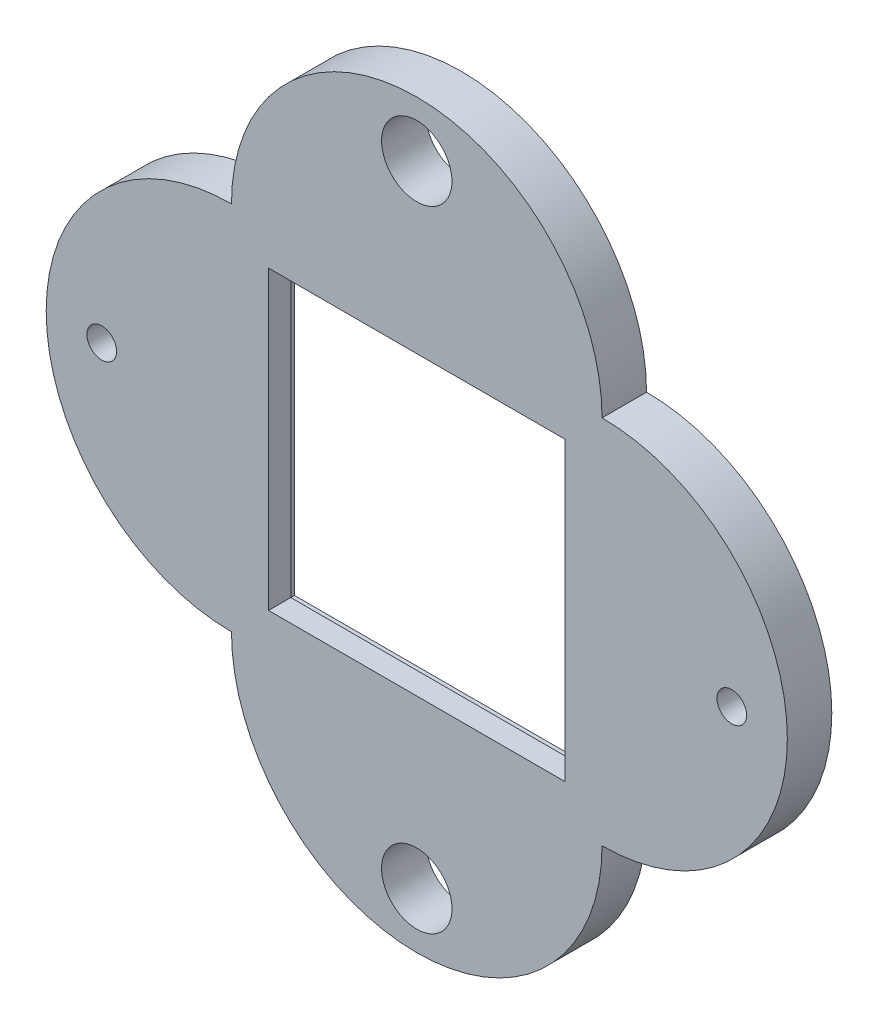
ISO-10303-21;
HEADER;
FILE_DESCRIPTION(('STEP AP214'),'2;1');
FILE_NAME('part.step','',(''),(''),'','','');
FILE_SCHEMA(('AUTOMOTIVE_DESIGN { 1 0 10303 214 1 1 1 1 }'));
ENDSEC;
DATA;
#1=APPLICATION_CONTEXT('core data for automotive mechanical design processes');
#2=APPLICATION_PROTOCOL_DEFINITION('international standard','automotive_design',2000,#1);
#3=PRODUCT_CONTEXT('',#1,'mechanical');
#4=PRODUCT('Part','Part','',(#3));
#5=PRODUCT_RELATED_PRODUCT_CATEGORY('part','',(#4));
#6=PRODUCT_DEFINITION_FORMATION('','',#4);
#7=PRODUCT_DEFINITION_CONTEXT('part definition',#1,'design');
#8=PRODUCT_DEFINITION('design','',#6,#7);
#9=PRODUCT_DEFINITION_SHAPE('','',#8);
#10=(LENGTH_UNIT() NAMED_UNIT(*) SI_UNIT(.MILLI.,.METRE.));
#11=(NAMED_UNIT(*) PLANE_ANGLE_UNIT() SI_UNIT($,.RADIAN.));
#12=(NAMED_UNIT(*) SI_UNIT($,.STERADIAN.) SOLID_ANGLE_UNIT());
#13=UNCERTAINTY_MEASURE_WITH_UNIT(LENGTH_MEASURE(1.E-05),#10,'distance_accuracy_value','');
#14=(GEOMETRIC_REPRESENTATION_CONTEXT(3) GLOBAL_UNCERTAINTY_ASSIGNED_CONTEXT((#13)) GLOBAL_UNIT_ASSIGNED_CONTEXT((#10,
#11,#12)) REPRESENTATION_CONTEXT('',''));
#15=CARTESIAN_POINT('',(0.,0.,0.));
#16=DIRECTION('',(0.,0.,1.));
#17=DIRECTION('',(1.,0.,0.));
#18=AXIS2_PLACEMENT_3D('',#15,#16,#17);
#19=CARTESIAN_POINT('',(0.,43.0480480480481,12.));
#20=DIRECTION('',(0.,1.,0.));
#21=DIRECTION('',(0.,0.,1.));
#22=AXIS2_PLACEMENT_3D('',#19,#20,#21);
#23=PLANE('',#22);
#24=DIRECTION('',(-1.,0.,0.));
#25=VECTOR('',#24,1.);
#26=CARTESIAN_POINT('',(-49.0540540540541,43.0480480480481,6.));
#27=LINE('',#26,#25);
#28=CARTESIAN_POINT('',(40.9459459459459,43.0480480480481,6.));
#29=VERTEX_POINT('',#28);
#30=CARTESIAN_POINT('',(-49.0540540540541,43.0480480480481,6.));
#31=VERTEX_POINT('',#30);
#32=EDGE_CURVE('E182',#29,#31,#27,.T.);
#33=ORIENTED_EDGE('',*,*,#32,.T.);
#34=DIRECTION('',(0.,0.,-1.));
#35=VECTOR('',#34,1.);
#36=CARTESIAN_POINT('',(-49.0540540540541,43.0480480480481,12.));
#37=LINE('',#36,#35);
#38=CARTESIAN_POINT('',(-49.0540540540541,43.0480480480481,0.));
#39=VERTEX_POINT('',#38);
#40=EDGE_CURVE('E205',#31,#39,#37,.T.);
#41=ORIENTED_EDGE('',*,*,#40,.T.);
#42=DIRECTION('',(1.,0.,0.));
#43=VECTOR('',#42,1.);
#44=CARTESIAN_POINT('',(0.,43.0480480480481,0.));
#45=LINE('',#44,#43);
#46=CARTESIAN_POINT('',(40.9459459459459,43.0480480480481,0.));
#47=VERTEX_POINT('',#46);
#48=EDGE_CURVE('E214',#39,#47,#45,.T.);
#49=ORIENTED_EDGE('',*,*,#48,.T.);
#50=DIRECTION('',(0.,0.,-1.));
#51=VECTOR('',#50,1.);
#52=CARTESIAN_POINT('',(40.9459459459459,43.0480480480481,12.));
#53=LINE('',#52,#51);
#54=EDGE_CURVE('E38',#29,#47,#53,.T.);
#55=ORIENTED_EDGE('',*,*,#54,.F.);
#56=EDGE_LOOP('',(#33,#41,#49,#55));
#57=FACE_BOUND('',#56,.T.);
#58=ADVANCED_FACE('F34',(#57),#23,.F.);
#59=CARTESIAN_POINT('',(40.9459459459459,0.,12.));
#60=DIRECTION('',(1.,0.,0.));
#61=DIRECTION('',(0.,1.,0.));
#62=AXIS2_PLACEMENT_3D('',#59,#60,#61);
#63=PLANE('',#62);
#64=DIRECTION('',(0.,1.,0.));
#65=VECTOR('',#64,1.);
#66=CARTESIAN_POINT('',(40.9459459459459,43.0480480480481,6.));
#67=LINE('',#66,#65);
#68=CARTESIAN_POINT('',(40.9459459459459,-46.9519519519519,6.));
#69=VERTEX_POINT('',#68);
#70=EDGE_CURVE('E179',#69,#29,#67,.T.);
#71=ORIENTED_EDGE('',*,*,#70,.T.);
#72=ORIENTED_EDGE('',*,*,#54,.T.);
#73=DIRECTION('',(0.,-1.,0.));
#74=VECTOR('',#73,1.);
#75=CARTESIAN_POINT('',(40.9459459459459,0.,0.));
#76=LINE('',#75,#74);
#77=CARTESIAN_POINT('',(40.9459459459459,-46.9519519519519,0.));
#78=VERTEX_POINT('',#77);
#79=EDGE_CURVE('E217',#47,#78,#76,.T.);
#80=ORIENTED_EDGE('',*,*,#79,.T.);
#81=DIRECTION('',(0.,0.,-1.));
#82=VECTOR('',#81,1.);
#83=CARTESIAN_POINT('',(40.9459459459459,-46.9519519519519,12.));
#84=LINE('',#83,#82);
#85=EDGE_CURVE('E244',#69,#78,#84,.T.);
#86=ORIENTED_EDGE('',*,*,#85,.F.);
#87=EDGE_LOOP('',(#71,#72,#80,#86));
#88=FACE_BOUND('',#87,.T.);
#89=ADVANCED_FACE('F251',(#88),#63,.F.);
#90=CARTESIAN_POINT('',(0.,-46.9519519519519,12.));
#91=DIRECTION('',(0.,1.,0.));
#92=DIRECTION('',(0.,0.,1.));
#93=AXIS2_PLACEMENT_3D('',#90,#91,#92);
#94=PLANE('',#93);
#95=DIRECTION('',(0.,0.,-1.));
#96=VECTOR('',#95,1.);
#97=CARTESIAN_POINT('',(-49.054054054054,-46.9519519519519,12.));
#98=LINE('',#97,#96);
#99=CARTESIAN_POINT('',(-49.054054054054,-46.9519519519519,6.));
#100=VERTEX_POINT('',#99);
#101=CARTESIAN_POINT('',(-49.054054054054,-46.9519519519519,0.));
#102=VERTEX_POINT('',#101);
#103=EDGE_CURVE('E243',#100,#102,#98,.T.);
#104=ORIENTED_EDGE('',*,*,#103,.F.);
#105=DIRECTION('',(1.,0.,0.));
#106=VECTOR('',#105,1.);
#107=CARTESIAN_POINT('',(-49.0540540540541,-46.9519519519519,6.));
#108=LINE('',#107,#106);
#109=EDGE_CURVE('E51',#100,#69,#108,.T.);
#110=ORIENTED_EDGE('',*,*,#109,.T.);
#111=ORIENTED_EDGE('',*,*,#85,.T.);
#112=DIRECTION('',(1.,0.,0.));
#113=VECTOR('',#112,1.);
#114=CARTESIAN_POINT('',(0.,-46.9519519519519,0.));
#115=LINE('',#114,#113);
#116=EDGE_CURVE('E220',#102,#78,#115,.T.);
#117=ORIENTED_EDGE('',*,*,#116,.F.);
#118=EDGE_LOOP('',(#104,#110,#111,#117));
#119=FACE_BOUND('',#118,.T.);
#120=ADVANCED_FACE('F262',(#119),#94,.T.);
#121=CARTESIAN_POINT('',(-49.0540540540541,0.,12.));
#122=DIRECTION('',(1.,0.,0.));
#123=DIRECTION('',(0.,1.,0.));
#124=AXIS2_PLACEMENT_3D('',#121,#122,#123);
#125=PLANE('',#124);
#126=ORIENTED_EDGE('',*,*,#40,.F.);
#127=DIRECTION('',(0.,-1.,0.));
#128=VECTOR('',#127,1.);
#129=CARTESIAN_POINT('',(-49.0540540540541,43.0480480480481,6.));
#130=LINE('',#129,#128);
#131=EDGE_CURVE('E173',#31,#100,#130,.T.);
#132=ORIENTED_EDGE('',*,*,#131,.T.);
#133=ORIENTED_EDGE('',*,*,#103,.T.);
#134=DIRECTION('',(0.,-1.,0.));
#135=VECTOR('',#134,1.);
#136=CARTESIAN_POINT('',(-49.0540540540541,0.,0.));
#137=LINE('',#136,#135);
#138=EDGE_CURVE('E223',#39,#102,#137,.T.);
#139=ORIENTED_EDGE('',*,*,#138,.F.);
#140=EDGE_LOOP('',(#126,#132,#133,#139));
#141=FACE_BOUND('',#140,.T.);
#142=ADVANCED_FACE('F260',(#141),#125,.T.);
#143=CARTESIAN_POINT('',(-4.05405405405406,48.0480480480481,12.));
#144=DIRECTION('',(0.,0.,-1.));
#145=DIRECTION('',(-1.,0.,0.));
#146=AXIS2_PLACEMENT_3D('',#143,#144,#145);
#147=CYLINDRICAL_SURFACE('',#146,50.);
#148=CARTESIAN_POINT('',(-4.05405405405406,48.0480480480481,0.));
#149=DIRECTION('',(0.,0.,1.));
#150=DIRECTION('',(1.,0.,0.));
#151=AXIS2_PLACEMENT_3D('',#148,#149,#150);
#152=CIRCLE('',#151,50.);
#153=CARTESIAN_POINT('',(45.9459459459459,48.0480480480481,0.));
#154=VERTEX_POINT('',#153);
#155=CARTESIAN_POINT('',(-54.0540540540541,48.0480480480481,0.));
#156=VERTEX_POINT('',#155);
#157=EDGE_CURVE('E226',#154,#156,#152,.T.);
#158=ORIENTED_EDGE('',*,*,#157,.T.);
#159=DIRECTION('',(0.,0.,-1.));
#160=VECTOR('',#159,1.);
#161=CARTESIAN_POINT('',(-54.0540540540541,48.0480480480481,12.));
#162=LINE('',#161,#160);
#163=CARTESIAN_POINT('',(-54.0540540540541,48.0480480480481,12.));
#164=VERTEX_POINT('',#163);
#165=EDGE_CURVE('E11',#164,#156,#162,.T.);
#166=ORIENTED_EDGE('',*,*,#165,.F.);
#167=CARTESIAN_POINT('',(-4.05405405405406,48.0480480480481,12.));
#168=DIRECTION('',(0.,0.,1.));
#169=DIRECTION('',(1.,0.,0.));
#170=AXIS2_PLACEMENT_3D('',#167,#168,#169);
#171=CIRCLE('',#170,50.);
#172=CARTESIAN_POINT('',(45.9459459459459,48.0480480480481,12.));
#173=VERTEX_POINT('',#172);
#174=EDGE_CURVE('E196',#173,#164,#171,.T.);
#175=ORIENTED_EDGE('',*,*,#174,.F.);
#176=DIRECTION('',(0.,0.,-1.));
#177=VECTOR('',#176,1.);
#178=CARTESIAN_POINT('',(45.9459459459459,48.0480480480481,12.));
#179=LINE('',#178,#177);
#180=EDGE_CURVE('E236',#173,#154,#179,.T.);
#181=ORIENTED_EDGE('',*,*,#180,.T.);
#182=EDGE_LOOP('',(#158,#166,#175,#181));
#183=FACE_BOUND('',#182,.T.);
#184=ADVANCED_FACE('F269',(#183),#147,.T.);
#185=CARTESIAN_POINT('',(-54.0540540540541,-1.95195195195194,12.));
#186=DIRECTION('',(0.,0.,-1.));
#187=DIRECTION('',(-1.,0.,0.));
#188=AXIS2_PLACEMENT_3D('',#185,#186,#187);
#189=CYLINDRICAL_SURFACE('',#188,50.);
#190=CARTESIAN_POINT('',(-54.0540540540541,-1.95195195195194,0.));
#191=DIRECTION('',(0.,0.,1.));
#192=DIRECTION('',(1.,0.,0.));
#193=AXIS2_PLACEMENT_3D('',#190,#191,#192);
#194=CIRCLE('',#193,50.);
#195=CARTESIAN_POINT('',(-54.0540540540541,-51.9519519519519,0.));
#196=VERTEX_POINT('',#195);
#197=EDGE_CURVE('E229',#156,#196,#194,.T.);
#198=ORIENTED_EDGE('',*,*,#197,.T.);
#199=DIRECTION('',(0.,0.,-1.));
#200=VECTOR('',#199,1.);
#201=CARTESIAN_POINT('',(-54.0540540540541,-51.9519519519519,12.));
#202=LINE('',#201,#200);
#203=CARTESIAN_POINT('',(-54.0540540540541,-51.9519519519519,12.));
#204=VERTEX_POINT('',#203);
#205=EDGE_CURVE('E43',#204,#196,#202,.T.);
#206=ORIENTED_EDGE('',*,*,#205,.F.);
#207=CARTESIAN_POINT('',(-54.0540540540541,-1.95195195195194,12.));
#208=DIRECTION('',(0.,0.,1.));
#209=DIRECTION('',(1.,0.,0.));
#210=AXIS2_PLACEMENT_3D('',#207,#208,#209);
#211=CIRCLE('',#210,50.);
#212=EDGE_CURVE('E100',#164,#204,#211,.T.);
#213=ORIENTED_EDGE('',*,*,#212,.F.);
#214=ORIENTED_EDGE('',*,*,#165,.T.);
#215=EDGE_LOOP('',(#198,#206,#213,#214));
#216=FACE_BOUND('',#215,.T.);
#217=ADVANCED_FACE('F317',(#216),#189,.T.);
#218=CARTESIAN_POINT('',(-4.05405405405405,-51.9519519519519,12.));
#219=DIRECTION('',(0.,0.,-1.));
#220=DIRECTION('',(-1.,0.,0.));
#221=AXIS2_PLACEMENT_3D('',#218,#219,#220);
#222=CYLINDRICAL_SURFACE('',#221,50.);
#223=CARTESIAN_POINT('',(-4.05405405405405,-51.9519519519519,0.));
#224=DIRECTION('',(0.,0.,1.));
#225=DIRECTION('',(1.,0.,0.));
#226=AXIS2_PLACEMENT_3D('',#223,#224,#225);
#227=CIRCLE('',#226,50.);
#228=CARTESIAN_POINT('',(45.9459459459459,-51.9519519519519,0.));
#229=VERTEX_POINT('',#228);
#230=EDGE_CURVE('E231',#196,#229,#227,.T.);
#231=ORIENTED_EDGE('',*,*,#230,.T.);
#232=DIRECTION('',(0.,0.,-1.));
#233=VECTOR('',#232,1.);
#234=CARTESIAN_POINT('',(45.9459459459459,-51.9519519519519,12.));
#235=LINE('',#234,#233);
#236=CARTESIAN_POINT('',(45.9459459459459,-51.9519519519519,12.));
#237=VERTEX_POINT('',#236);
#238=EDGE_CURVE('E238',#237,#229,#235,.T.);
#239=ORIENTED_EDGE('',*,*,#238,.F.);
#240=CARTESIAN_POINT('',(-4.05405405405405,-51.9519519519519,12.));
#241=DIRECTION('',(0.,0.,1.));
#242=DIRECTION('',(1.,0.,0.));
#243=AXIS2_PLACEMENT_3D('',#240,#241,#242);
#244=CIRCLE('',#243,50.);
#245=EDGE_CURVE('E199',#204,#237,#244,.T.);
#246=ORIENTED_EDGE('',*,*,#245,.F.);
#247=ORIENTED_EDGE('',*,*,#205,.T.);
#248=EDGE_LOOP('',(#231,#239,#246,#247));
#249=FACE_BOUND('',#248,.T.);
#250=ADVANCED_FACE('F314',(#249),#222,.T.);
#251=CARTESIAN_POINT('',(45.945945945946,-1.95195195195194,12.));
#252=DIRECTION('',(0.,0.,-1.));
#253=DIRECTION('',(-1.,0.,0.));
#254=AXIS2_PLACEMENT_3D('',#251,#252,#253);
#255=CYLINDRICAL_SURFACE('',#254,50.);
#256=CARTESIAN_POINT('',(45.945945945946,-1.95195195195194,0.));
#257=DIRECTION('',(0.,0.,1.));
#258=DIRECTION('',(1.,0.,0.));
#259=AXIS2_PLACEMENT_3D('',#256,#257,#258);
#260=CIRCLE('',#259,50.);
#261=EDGE_CURVE('E93',#229,#154,#260,.T.);
#262=ORIENTED_EDGE('',*,*,#261,.T.);
#263=ORIENTED_EDGE('',*,*,#180,.F.);
#264=CARTESIAN_POINT('',(45.945945945946,-1.95195195195194,12.));
#265=DIRECTION('',(0.,0.,1.));
#266=DIRECTION('',(1.,0.,0.));
#267=AXIS2_PLACEMENT_3D('',#264,#265,#266);
#268=CIRCLE('',#267,50.);
#269=EDGE_CURVE('E60',#237,#173,#268,.T.);
#270=ORIENTED_EDGE('',*,*,#269,.F.);
#271=ORIENTED_EDGE('',*,*,#238,.T.);
#272=EDGE_LOOP('',(#262,#263,#270,#271));
#273=FACE_BOUND('',#272,.T.);
#274=ADVANCED_FACE('F280',(#273),#255,.T.);
#275=CARTESIAN_POINT('',(-4.05405405405406,83.0480480480481,12.));
#276=DIRECTION('',(0.,0.,-1.));
#277=DIRECTION('',(-1.,0.,0.));
#278=AXIS2_PLACEMENT_3D('',#275,#276,#277);
#279=CYLINDRICAL_SURFACE('',#278,9.5);
#280=CARTESIAN_POINT('',(-4.05405405405406,83.0480480480481,12.));
#281=DIRECTION('',(0.,0.,1.));
#282=DIRECTION('',(1.,0.,0.));
#283=AXIS2_PLACEMENT_3D('',#280,#281,#282);
#284=CIRCLE('',#283,9.5);
#285=CARTESIAN_POINT('',(5.44594594594593,83.0480480480481,12.));
#286=VERTEX_POINT('',#285);
#287=EDGE_CURVE('E193',#286,#286,#284,.T.);
#288=ORIENTED_EDGE('',*,*,#287,.T.);
#289=EDGE_LOOP('',(#288));
#290=FACE_BOUND('',#289,.T.);
#291=CARTESIAN_POINT('',(-4.05405405405406,83.0480480480481,0.));
#292=DIRECTION('',(0.,0.,1.));
#293=DIRECTION('',(1.,0.,0.));
#294=AXIS2_PLACEMENT_3D('',#291,#292,#293);
#295=CIRCLE('',#294,9.5);
#296=CARTESIAN_POINT('',(5.44594594594593,83.0480480480481,0.));
#297=VERTEX_POINT('',#296);
#298=EDGE_CURVE('E211',#297,#297,#295,.T.);
#299=ORIENTED_EDGE('',*,*,#298,.F.);
#300=EDGE_LOOP('',(#299));
#301=FACE_BOUND('',#300,.T.);
#302=ADVANCED_FACE('F277',(#290,#301),#279,.F.);
#303=CARTESIAN_POINT('',(-89.0540540540541,-1.95195195195194,12.));
#304=DIRECTION('',(0.,0.,-1.));
#305=DIRECTION('',(-1.,0.,0.));
#306=AXIS2_PLACEMENT_3D('',#303,#304,#305);
#307=CYLINDRICAL_SURFACE('',#306,4.00000000000001);
#308=CARTESIAN_POINT('',(-89.0540540540541,-1.95195195195194,12.));
#309=DIRECTION('',(0.,0.,1.));
#310=DIRECTION('',(1.,0.,0.));
#311=AXIS2_PLACEMENT_3D('',#308,#309,#310);
#312=CIRCLE('',#311,4.00000000000001);
#313=CARTESIAN_POINT('',(-85.0540540540541,-1.95195195195194,12.));
#314=VERTEX_POINT('',#313);
#315=EDGE_CURVE('E189',#314,#314,#312,.T.);
#316=ORIENTED_EDGE('',*,*,#315,.T.);
#317=EDGE_LOOP('',(#316));
#318=FACE_BOUND('',#317,.T.);
#319=CARTESIAN_POINT('',(-89.0540540540541,-1.95195195195194,0.));
#320=DIRECTION('',(0.,0.,1.));
#321=DIRECTION('',(1.,0.,0.));
#322=AXIS2_PLACEMENT_3D('',#319,#320,#321);
#323=CIRCLE('',#322,4.00000000000001);
#324=CARTESIAN_POINT('',(-85.0540540540541,-1.95195195195194,0.));
#325=VERTEX_POINT('',#324);
#326=EDGE_CURVE('E208',#325,#325,#323,.T.);
#327=ORIENTED_EDGE('',*,*,#326,.F.);
#328=EDGE_LOOP('',(#327));
#329=FACE_BOUND('',#328,.T.);
#330=ADVANCED_FACE('F279',(#318,#329),#307,.F.);
#331=CARTESIAN_POINT('',(-4.05405405405406,-86.9519519519519,12.));
#332=DIRECTION('',(0.,0.,-1.));
#333=DIRECTION('',(-1.,0.,0.));
#334=AXIS2_PLACEMENT_3D('',#331,#332,#333);
#335=CYLINDRICAL_SURFACE('',#334,9.50000000000001);
#336=CARTESIAN_POINT('',(-4.05405405405406,-86.9519519519519,12.));
#337=DIRECTION('',(0.,0.,1.));
#338=DIRECTION('',(1.,0.,0.));
#339=AXIS2_PLACEMENT_3D('',#336,#337,#338);
#340=CIRCLE('',#339,9.50000000000001);
#341=CARTESIAN_POINT('',(5.44594594594595,-86.9519519519519,12.));
#342=VERTEX_POINT('',#341);
#343=EDGE_CURVE('E186',#342,#342,#340,.F.);
#344=ORIENTED_EDGE('',*,*,#343,.F.);
#345=EDGE_LOOP('',(#344));
#346=FACE_BOUND('',#345,.T.);
#347=CARTESIAN_POINT('',(-4.05405405405406,-86.9519519519519,0.));
#348=DIRECTION('',(0.,0.,1.));
#349=DIRECTION('',(1.,0.,0.));
#350=AXIS2_PLACEMENT_3D('',#347,#348,#349);
#351=CIRCLE('',#350,9.50000000000001);
#352=CARTESIAN_POINT('',(5.44594594594595,-86.9519519519519,0.));
#353=VERTEX_POINT('',#352);
#354=EDGE_CURVE('E185',#353,#353,#351,.F.);
#355=ORIENTED_EDGE('',*,*,#354,.T.);
#356=EDGE_LOOP('',(#355));
#357=FACE_BOUND('',#356,.T.);
#358=ADVANCED_FACE('F36',(#346,#357),#335,.F.);
#359=CARTESIAN_POINT('',(80.9459459459459,-1.95195195195192,12.));
#360=DIRECTION('',(0.,0.,-1.));
#361=DIRECTION('',(-1.,0.,0.));
#362=AXIS2_PLACEMENT_3D('',#359,#360,#361);
#363=CYLINDRICAL_SURFACE('',#362,4.00000000000001);
#364=CARTESIAN_POINT('',(80.9459459459459,-1.95195195195192,12.));
#365=DIRECTION('',(0.,0.,1.));
#366=DIRECTION('',(1.,0.,0.));
#367=AXIS2_PLACEMENT_3D('',#364,#365,#366);
#368=CIRCLE('',#367,4.00000000000001);
#369=CARTESIAN_POINT('',(84.9459459459459,-1.95195195195192,12.));
#370=VERTEX_POINT('',#369);
#371=EDGE_CURVE('E202',#370,#370,#368,.F.);
#372=ORIENTED_EDGE('',*,*,#371,.F.);
#373=EDGE_LOOP('',(#372));
#374=FACE_BOUND('',#373,.T.);
#375=CARTESIAN_POINT('',(80.9459459459459,-1.95195195195192,0.));
#376=DIRECTION('',(0.,0.,1.));
#377=DIRECTION('',(1.,0.,0.));
#378=AXIS2_PLACEMENT_3D('',#375,#376,#377);
#379=CIRCLE('',#378,4.00000000000001);
#380=CARTESIAN_POINT('',(84.9459459459459,-1.95195195195192,0.));
#381=VERTEX_POINT('',#380);
#382=EDGE_CURVE('E190',#381,#381,#379,.F.);
#383=ORIENTED_EDGE('',*,*,#382,.T.);
#384=EDGE_LOOP('',(#383));
#385=FACE_BOUND('',#384,.T.);
#386=ADVANCED_FACE('F287',(#374,#385),#363,.F.);
#387=CARTESIAN_POINT('',(0.,0.,12.));
#388=DIRECTION('',(0.,0.,1.));
#389=DIRECTION('',(1.,0.,0.));
#390=AXIS2_PLACEMENT_3D('',#387,#388,#389);
#391=PLANE('',#390);
#392=ORIENTED_EDGE('',*,*,#343,.T.);
#393=EDGE_LOOP('',(#392));
#394=FACE_BOUND('',#393,.T.);
#395=ORIENTED_EDGE('',*,*,#315,.F.);
#396=EDGE_LOOP('',(#395));
#397=FACE_BOUND('',#396,.T.);
#398=ORIENTED_EDGE('',*,*,#287,.F.);
#399=EDGE_LOOP('',(#398));
#400=FACE_BOUND('',#399,.T.);
#401=ORIENTED_EDGE('',*,*,#174,.T.);
#402=ORIENTED_EDGE('',*,*,#212,.T.);
#403=ORIENTED_EDGE('',*,*,#245,.T.);
#404=ORIENTED_EDGE('',*,*,#269,.T.);
#405=EDGE_LOOP('',(#401,#402,#403,#404));
#406=FACE_BOUND('',#405,.T.);
#407=ORIENTED_EDGE('',*,*,#371,.T.);
#408=EDGE_LOOP('',(#407));
#409=FACE_BOUND('',#408,.T.);
#410=DIRECTION('',(0.,-1.,0.));
#411=VECTOR('',#410,1.);
#412=CARTESIAN_POINT('',(-44.0540540540541,38.0480480480481,12.));
#413=LINE('',#412,#411);
#414=CARTESIAN_POINT('',(-44.0540540540541,38.0480480480481,12.));
#415=VERTEX_POINT('',#414);
#416=CARTESIAN_POINT('',(-44.0540540540541,-41.9519519519519,12.));
#417=VERTEX_POINT('',#416);
#418=EDGE_CURVE('E141',#415,#417,#413,.T.);
#419=ORIENTED_EDGE('',*,*,#418,.F.);
#420=DIRECTION('',(-1.,0.,0.));
#421=VECTOR('',#420,1.);
#422=CARTESIAN_POINT('',(-44.0540540540541,38.0480480480481,12.));
#423=LINE('',#422,#421);
#424=CARTESIAN_POINT('',(35.9459459459459,38.0480480480481,12.));
#425=VERTEX_POINT('',#424);
#426=EDGE_CURVE('E158',#425,#415,#423,.T.);
#427=ORIENTED_EDGE('',*,*,#426,.F.);
#428=DIRECTION('',(0.,1.,0.));
#429=VECTOR('',#428,1.);
#430=CARTESIAN_POINT('',(35.9459459459459,38.0480480480481,12.));
#431=LINE('',#430,#429);
#432=CARTESIAN_POINT('',(35.9459459459459,-41.9519519519519,12.));
#433=VERTEX_POINT('',#432);
#434=EDGE_CURVE('E161',#433,#425,#431,.T.);
#435=ORIENTED_EDGE('',*,*,#434,.F.);
#436=DIRECTION('',(1.,0.,0.));
#437=VECTOR('',#436,1.);
#438=CARTESIAN_POINT('',(-44.0540540540541,-41.9519519519519,12.));
#439=LINE('',#438,#437);
#440=EDGE_CURVE('E167',#417,#433,#439,.T.);
#441=ORIENTED_EDGE('',*,*,#440,.F.);
#442=EDGE_LOOP('',(#419,#427,#435,#441));
#443=FACE_BOUND('',#442,.T.);
#444=ADVANCED_FACE('F295',(#394,#397,#400,#406,#409,#443),#391,.T.);
#445=CARTESIAN_POINT('',(0.,0.,0.));
#446=DIRECTION('',(0.,0.,1.));
#447=DIRECTION('',(1.,0.,0.));
#448=AXIS2_PLACEMENT_3D('',#445,#446,#447);
#449=PLANE('',#448);
#450=ORIENTED_EDGE('',*,*,#354,.F.);
#451=EDGE_LOOP('',(#450));
#452=FACE_BOUND('',#451,.T.);
#453=ORIENTED_EDGE('',*,*,#326,.T.);
#454=EDGE_LOOP('',(#453));
#455=FACE_BOUND('',#454,.T.);
#456=ORIENTED_EDGE('',*,*,#298,.T.);
#457=EDGE_LOOP('',(#456));
#458=FACE_BOUND('',#457,.T.);
#459=ORIENTED_EDGE('',*,*,#48,.F.);
#460=ORIENTED_EDGE('',*,*,#138,.T.);
#461=ORIENTED_EDGE('',*,*,#116,.T.);
#462=ORIENTED_EDGE('',*,*,#79,.F.);
#463=EDGE_LOOP('',(#459,#460,#461,#462));
#464=FACE_BOUND('',#463,.T.);
#465=ORIENTED_EDGE('',*,*,#157,.F.);
#466=ORIENTED_EDGE('',*,*,#261,.F.);
#467=ORIENTED_EDGE('',*,*,#230,.F.);
#468=ORIENTED_EDGE('',*,*,#197,.F.);
#469=EDGE_LOOP('',(#465,#466,#467,#468));
#470=FACE_BOUND('',#469,.T.);
#471=ORIENTED_EDGE('',*,*,#382,.F.);
#472=EDGE_LOOP('',(#471));
#473=FACE_BOUND('',#472,.T.);
#474=ADVANCED_FACE('F255',(#452,#455,#458,#464,#470,#473),#449,.F.);
#475=CARTESIAN_POINT('',(0.,0.,6.));
#476=DIRECTION('',(0.,0.,1.));
#477=DIRECTION('',(1.,0.,0.));
#478=AXIS2_PLACEMENT_3D('',#475,#476,#477);
#479=PLANE('',#478);
#480=DIRECTION('',(-1.,0.,0.));
#481=VECTOR('',#480,1.);
#482=CARTESIAN_POINT('',(-44.0540540540541,38.0480480480481,6.));
#483=LINE('',#482,#481);
#484=CARTESIAN_POINT('',(35.9459459459459,38.0480480480481,6.));
#485=VERTEX_POINT('',#484);
#486=CARTESIAN_POINT('',(-44.0540540540541,38.0480480480481,6.));
#487=VERTEX_POINT('',#486);
#488=EDGE_CURVE('E146',#485,#487,#483,.T.);
#489=ORIENTED_EDGE('',*,*,#488,.T.);
#490=DIRECTION('',(0.,-1.,0.));
#491=VECTOR('',#490,1.);
#492=CARTESIAN_POINT('',(-44.0540540540541,38.0480480480481,6.));
#493=LINE('',#492,#491);
#494=CARTESIAN_POINT('',(-44.0540540540541,-41.9519519519519,6.));
#495=VERTEX_POINT('',#494);
#496=EDGE_CURVE('E138',#487,#495,#493,.T.);
#497=ORIENTED_EDGE('',*,*,#496,.T.);
#498=DIRECTION('',(1.,0.,0.));
#499=VECTOR('',#498,1.);
#500=CARTESIAN_POINT('',(-44.0540540540541,-41.9519519519519,6.));
#501=LINE('',#500,#499);
#502=CARTESIAN_POINT('',(35.9459459459459,-41.9519519519519,6.));
#503=VERTEX_POINT('',#502);
#504=EDGE_CURVE('E150',#495,#503,#501,.T.);
#505=ORIENTED_EDGE('',*,*,#504,.T.);
#506=DIRECTION('',(0.,1.,0.));
#507=VECTOR('',#506,1.);
#508=CARTESIAN_POINT('',(35.9459459459459,38.0480480480481,6.));
#509=LINE('',#508,#507);
#510=EDGE_CURVE('E154',#503,#485,#509,.T.);
#511=ORIENTED_EDGE('',*,*,#510,.T.);
#512=EDGE_LOOP('',(#489,#497,#505,#511));
#513=FACE_BOUND('',#512,.T.);
#514=ORIENTED_EDGE('',*,*,#131,.F.);
#515=ORIENTED_EDGE('',*,*,#32,.F.);
#516=ORIENTED_EDGE('',*,*,#70,.F.);
#517=ORIENTED_EDGE('',*,*,#109,.F.);
#518=EDGE_LOOP('',(#514,#515,#516,#517));
#519=FACE_BOUND('',#518,.T.);
#520=ADVANCED_FACE('F156',(#513,#519),#479,.F.);
#521=CARTESIAN_POINT('',(-44.0540540540541,38.0480480480481,6.));
#522=DIRECTION('',(-1.,0.,0.));
#523=DIRECTION('',(0.,-1.,0.));
#524=AXIS2_PLACEMENT_3D('',#521,#522,#523);
#525=PLANE('',#524);
#526=ORIENTED_EDGE('',*,*,#418,.T.);
#527=DIRECTION('',(0.,0.,1.));
#528=VECTOR('',#527,1.);
#529=CARTESIAN_POINT('',(-44.0540540540541,-41.9519519519519,6.));
#530=LINE('',#529,#528);
#531=EDGE_CURVE('E134',#495,#417,#530,.T.);
#532=ORIENTED_EDGE('',*,*,#531,.F.);
#533=ORIENTED_EDGE('',*,*,#496,.F.);
#534=DIRECTION('',(0.,0.,1.));
#535=VECTOR('',#534,1.);
#536=CARTESIAN_POINT('',(-44.0540540540541,38.0480480480481,6.));
#537=LINE('',#536,#535);
#538=EDGE_CURVE('E171',#487,#415,#537,.T.);
#539=ORIENTED_EDGE('',*,*,#538,.T.);
#540=EDGE_LOOP('',(#526,#532,#533,#539));
#541=FACE_BOUND('',#540,.T.);
#542=ADVANCED_FACE('F136',(#541),#525,.F.);
#543=CARTESIAN_POINT('',(-44.0540540540541,38.0480480480481,6.));
#544=DIRECTION('',(0.,1.,0.));
#545=DIRECTION('',(0.,0.,1.));
#546=AXIS2_PLACEMENT_3D('',#543,#544,#545);
#547=PLANE('',#546);
#548=ORIENTED_EDGE('',*,*,#426,.T.);
#549=ORIENTED_EDGE('',*,*,#538,.F.);
#550=ORIENTED_EDGE('',*,*,#488,.F.);
#551=DIRECTION('',(0.,0.,1.));
#552=VECTOR('',#551,1.);
#553=CARTESIAN_POINT('',(35.9459459459459,38.0480480480481,6.));
#554=LINE('',#553,#552);
#555=EDGE_CURVE('E174',#485,#425,#554,.T.);
#556=ORIENTED_EDGE('',*,*,#555,.T.);
#557=EDGE_LOOP('',(#548,#549,#550,#556));
#558=FACE_BOUND('',#557,.T.);
#559=ADVANCED_FACE('F340',(#558),#547,.F.);
#560=CARTESIAN_POINT('',(35.9459459459459,38.0480480480481,6.));
#561=DIRECTION('',(1.,0.,0.));
#562=DIRECTION('',(0.,1.,0.));
#563=AXIS2_PLACEMENT_3D('',#560,#561,#562);
#564=PLANE('',#563);
#565=ORIENTED_EDGE('',*,*,#434,.T.);
#566=ORIENTED_EDGE('',*,*,#555,.F.);
#567=ORIENTED_EDGE('',*,*,#510,.F.);
#568=DIRECTION('',(0.,0.,1.));
#569=VECTOR('',#568,1.);
#570=CARTESIAN_POINT('',(35.9459459459459,-41.9519519519519,6.));
#571=LINE('',#570,#569);
#572=EDGE_CURVE('E145',#503,#433,#571,.T.);
#573=ORIENTED_EDGE('',*,*,#572,.T.);
#574=EDGE_LOOP('',(#565,#566,#567,#573));
#575=FACE_BOUND('',#574,.T.);
#576=ADVANCED_FACE('F338',(#575),#564,.F.);
#577=CARTESIAN_POINT('',(-44.0540540540541,-41.9519519519519,6.));
#578=DIRECTION('',(0.,-1.,0.));
#579=DIRECTION('',(1.,0.,0.));
#580=AXIS2_PLACEMENT_3D('',#577,#578,#579);
#581=PLANE('',#580);
#582=ORIENTED_EDGE('',*,*,#440,.T.);
#583=ORIENTED_EDGE('',*,*,#572,.F.);
#584=ORIENTED_EDGE('',*,*,#504,.F.);
#585=ORIENTED_EDGE('',*,*,#531,.T.);
#586=EDGE_LOOP('',(#582,#583,#584,#585));
#587=FACE_BOUND('',#586,.T.);
#588=ADVANCED_FACE('F151',(#587),#581,.F.);
#589=CLOSED_SHELL('',(#58,#89,#120,#142,#184,#217,#250,#274,#302,#330,#358,#386,#444,#474,#520,
#542,#559,#576,#588));
#590=MANIFOLD_SOLID_BREP('B2',#589);
#591=ADVANCED_BREP_SHAPE_REPRESENTATION('',(#18,#590),#14);
#592=SHAPE_DEFINITION_REPRESENTATION(#9,#591);
ENDSEC;
END-ISO-10303-21;
